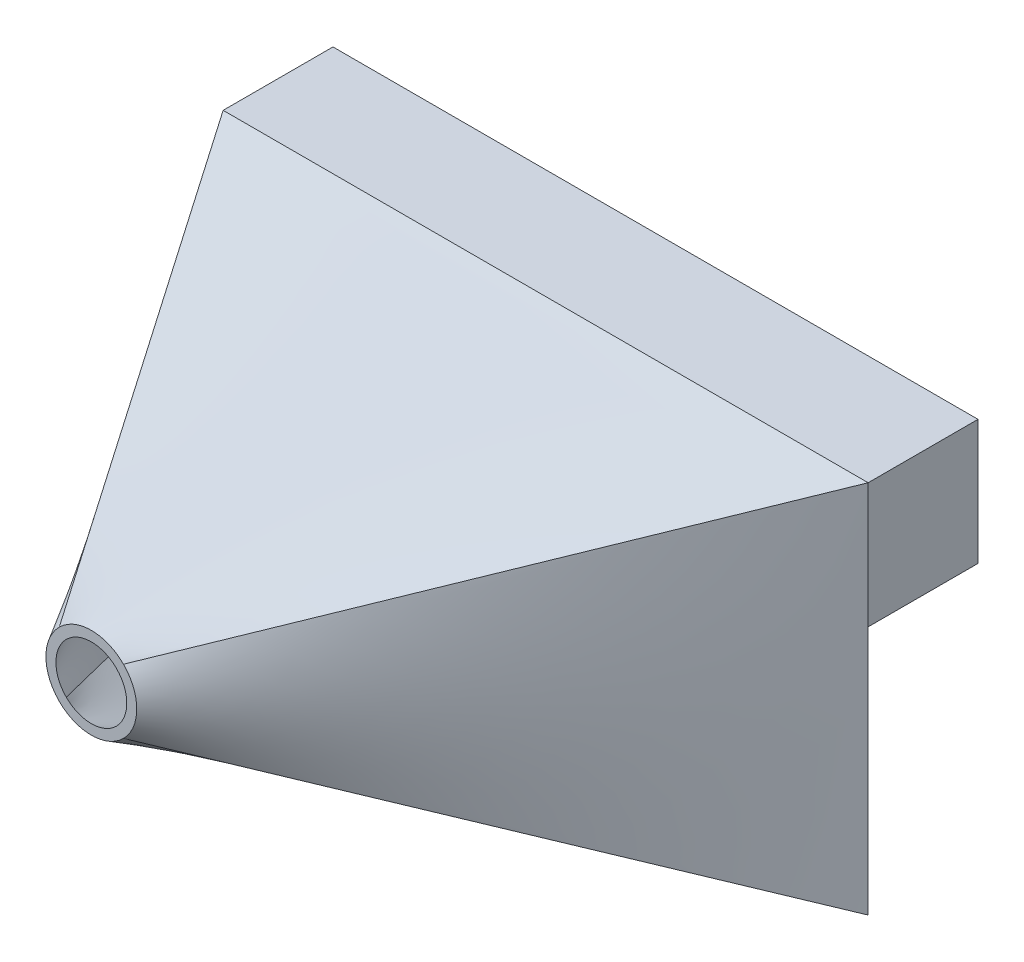
ISO-10303-21;
HEADER;
FILE_DESCRIPTION(('STEP AP214'),'2;1');
FILE_NAME('part.step','',(''),(''),'','','');
FILE_SCHEMA(('AUTOMOTIVE_DESIGN { 1 0 10303 214 1 1 1 1 }'));
ENDSEC;
DATA;
#1=APPLICATION_CONTEXT('core data for automotive mechanical design processes');
#2=APPLICATION_PROTOCOL_DEFINITION('international standard','automotive_design',2000,#1);
#3=PRODUCT_CONTEXT('',#1,'mechanical');
#4=PRODUCT('Part','Part','',(#3));
#5=PRODUCT_RELATED_PRODUCT_CATEGORY('part','',(#4));
#6=PRODUCT_DEFINITION_FORMATION('','',#4);
#7=PRODUCT_DEFINITION_CONTEXT('part definition',#1,'design');
#8=PRODUCT_DEFINITION('design','',#6,#7);
#9=PRODUCT_DEFINITION_SHAPE('','',#8);
#10=(LENGTH_UNIT() NAMED_UNIT(*) SI_UNIT(.MILLI.,.METRE.));
#11=(NAMED_UNIT(*) PLANE_ANGLE_UNIT() SI_UNIT($,.RADIAN.));
#12=(NAMED_UNIT(*) SI_UNIT($,.STERADIAN.) SOLID_ANGLE_UNIT());
#13=UNCERTAINTY_MEASURE_WITH_UNIT(LENGTH_MEASURE(1.E-05),#10,'distance_accuracy_value','');
#14=(GEOMETRIC_REPRESENTATION_CONTEXT(3) GLOBAL_UNCERTAINTY_ASSIGNED_CONTEXT((#13)) GLOBAL_UNIT_ASSIGNED_CONTEXT((#10,
#11,#12)) REPRESENTATION_CONTEXT('',''));
#15=CARTESIAN_POINT('',(0.,0.,0.));
#16=DIRECTION('',(0.,0.,1.));
#17=DIRECTION('',(1.,0.,0.));
#18=AXIS2_PLACEMENT_3D('',#15,#16,#17);
#19=CARTESIAN_POINT('',(-64.6,-37.5,22.));
#20=DIRECTION('',(0.,1.,0.));
#21=DIRECTION('',(0.,0.,1.));
#22=AXIS2_PLACEMENT_3D('',#19,#20,#21);
#23=PLANE('',#22);
#24=DIRECTION('',(1.,0.,0.));
#25=VECTOR('',#24,1.);
#26=CARTESIAN_POINT('',(-64.6,-37.5,0.));
#27=LINE('',#26,#25);
#28=CARTESIAN_POINT('',(-64.6,-37.5,0.));
#29=VERTEX_POINT('',#28);
#30=CARTESIAN_POINT('',(-62.6,-37.5,0.));
#31=VERTEX_POINT('',#30);
#32=EDGE_CURVE('E738',#29,#31,#27,.T.);
#33=ORIENTED_EDGE('',*,*,#32,.T.);
#34=DIRECTION('',(0.,0.,1.));
#35=VECTOR('',#34,1.);
#36=CARTESIAN_POINT('',(-62.6,-37.5,22.));
#37=LINE('',#36,#35);
#38=CARTESIAN_POINT('',(-62.6,-37.5,22.));
#39=VERTEX_POINT('',#38);
#40=EDGE_CURVE('E480',#31,#39,#37,.T.);
#41=ORIENTED_EDGE('',*,*,#40,.T.);
#42=DIRECTION('',(1.,0.,0.));
#43=VECTOR('',#42,1.);
#44=CARTESIAN_POINT('',(-64.6,-37.5,22.));
#45=LINE('',#44,#43);
#46=CARTESIAN_POINT('',(-64.6,-37.5,22.));
#47=VERTEX_POINT('',#46);
#48=EDGE_CURVE('E330',#47,#39,#45,.T.);
#49=ORIENTED_EDGE('',*,*,#48,.F.);
#50=DIRECTION('',(0.,0.,-1.));
#51=VECTOR('',#50,1.);
#52=CARTESIAN_POINT('',(-64.6,-37.5,22.));
#53=LINE('',#52,#51);
#54=EDGE_CURVE('E247',#47,#29,#53,.T.);
#55=ORIENTED_EDGE('',*,*,#54,.T.);
#56=EDGE_LOOP('',(#33,#41,#49,#55));
#57=FACE_BOUND('',#56,.T.);
#58=ADVANCED_FACE('F113',(#57),#23,.F.);
#59=CARTESIAN_POINT('',(0.,0.,0.));
#60=DIRECTION('',(0.,0.,1.));
#61=DIRECTION('',(1.,0.,0.));
#62=AXIS2_PLACEMENT_3D('',#59,#60,#61);
#63=PLANE('',#62);
#64=DIRECTION('',(0.,1.,0.));
#65=VECTOR('',#64,1.);
#66=CARTESIAN_POINT('',(64.6,37.5,0.));
#67=LINE('',#66,#65);
#68=CARTESIAN_POINT('',(64.6,12.5,0.));
#69=VERTEX_POINT('',#68);
#70=CARTESIAN_POINT('',(64.6,37.5,0.));
#71=VERTEX_POINT('',#70);
#72=EDGE_CURVE('E210',#69,#71,#67,.T.);
#73=ORIENTED_EDGE('',*,*,#72,.F.);
#74=DIRECTION('',(-1.,0.,0.));
#75=VECTOR('',#74,1.);
#76=CARTESIAN_POINT('',(72.6,12.5,0.));
#77=LINE('',#76,#75);
#78=CARTESIAN_POINT('',(62.6,12.5,0.));
#79=VERTEX_POINT('',#78);
#80=EDGE_CURVE('E721',#69,#79,#77,.T.);
#81=ORIENTED_EDGE('',*,*,#80,.T.);
#82=DIRECTION('',(0.,1.,0.));
#83=VECTOR('',#82,1.);
#84=CARTESIAN_POINT('',(62.6,35.5,0.));
#85=LINE('',#84,#83);
#86=CARTESIAN_POINT('',(62.6,35.5,0.));
#87=VERTEX_POINT('',#86);
#88=EDGE_CURVE('E729',#79,#87,#85,.T.);
#89=ORIENTED_EDGE('',*,*,#88,.T.);
#90=DIRECTION('',(-1.,0.,0.));
#91=VECTOR('',#90,1.);
#92=CARTESIAN_POINT('',(-62.6,35.5,0.));
#93=LINE('',#92,#91);
#94=CARTESIAN_POINT('',(-62.6,35.5,0.));
#95=VERTEX_POINT('',#94);
#96=EDGE_CURVE('E734',#87,#95,#93,.T.);
#97=ORIENTED_EDGE('',*,*,#96,.T.);
#98=DIRECTION('',(0.,-1.,0.));
#99=VECTOR('',#98,1.);
#100=CARTESIAN_POINT('',(-62.6,35.5,0.));
#101=LINE('',#100,#99);
#102=EDGE_CURVE('E174',#95,#31,#101,.T.);
#103=ORIENTED_EDGE('',*,*,#102,.T.);
#104=ORIENTED_EDGE('',*,*,#32,.F.);
#105=DIRECTION('',(0.,-1.,0.));
#106=VECTOR('',#105,1.);
#107=CARTESIAN_POINT('',(-64.6,37.5,0.));
#108=LINE('',#107,#106);
#109=CARTESIAN_POINT('',(-64.6,37.5,0.));
#110=VERTEX_POINT('',#109);
#111=EDGE_CURVE('E134',#110,#29,#108,.T.);
#112=ORIENTED_EDGE('',*,*,#111,.F.);
#113=DIRECTION('',(-1.,0.,0.));
#114=VECTOR('',#113,1.);
#115=CARTESIAN_POINT('',(-64.6,37.5,0.));
#116=LINE('',#115,#114);
#117=EDGE_CURVE('E216',#71,#110,#116,.T.);
#118=ORIENTED_EDGE('',*,*,#117,.F.);
#119=EDGE_LOOP('',(#73,#81,#89,#97,#103,#104,#112,#118));
#120=FACE_BOUND('',#119,.T.);
#121=ADVANCED_FACE('F219',(#120),#63,.F.);
#122=CARTESIAN_POINT('',(64.6,37.5,22.));
#123=DIRECTION('',(-1.,0.,0.));
#124=DIRECTION('',(0.,0.,1.));
#125=AXIS2_PLACEMENT_3D('',#122,#123,#124);
#126=PLANE('',#125);
#127=DIRECTION('',(0.,1.,0.));
#128=VECTOR('',#127,1.);
#129=CARTESIAN_POINT('',(64.6,37.5,22.));
#130=LINE('',#129,#128);
#131=CARTESIAN_POINT('',(64.6,12.5,22.));
#132=VERTEX_POINT('',#131);
#133=CARTESIAN_POINT('',(64.6,37.5,22.));
#134=VERTEX_POINT('',#133);
#135=EDGE_CURVE('E163',#132,#134,#130,.T.);
#136=ORIENTED_EDGE('',*,*,#135,.F.);
#137=DIRECTION('',(0.,0.,-1.));
#138=VECTOR('',#137,1.);
#139=CARTESIAN_POINT('',(64.6,12.5,22.));
#140=LINE('',#139,#138);
#141=EDGE_CURVE('E213',#132,#69,#140,.T.);
#142=ORIENTED_EDGE('',*,*,#141,.T.);
#143=ORIENTED_EDGE('',*,*,#72,.T.);
#144=DIRECTION('',(0.,0.,-1.));
#145=VECTOR('',#144,1.);
#146=CARTESIAN_POINT('',(64.6,37.5,22.));
#147=LINE('',#146,#145);
#148=EDGE_CURVE('E12',#134,#71,#147,.T.);
#149=ORIENTED_EDGE('',*,*,#148,.F.);
#150=EDGE_LOOP('',(#136,#142,#143,#149));
#151=FACE_BOUND('',#150,.T.);
#152=ADVANCED_FACE('F115',(#151),#126,.F.);
#153=CARTESIAN_POINT('',(-64.6,37.5,22.));
#154=DIRECTION('',(0.,-1.,0.));
#155=DIRECTION('',(0.,0.,-1.));
#156=AXIS2_PLACEMENT_3D('',#153,#154,#155);
#157=PLANE('',#156);
#158=ORIENTED_EDGE('',*,*,#117,.T.);
#159=DIRECTION('',(0.,0.,-1.));
#160=VECTOR('',#159,1.);
#161=CARTESIAN_POINT('',(-64.6,37.5,22.));
#162=LINE('',#161,#160);
#163=CARTESIAN_POINT('',(-64.6,37.5,22.));
#164=VERTEX_POINT('',#163);
#165=EDGE_CURVE('E125',#164,#110,#162,.T.);
#166=ORIENTED_EDGE('',*,*,#165,.F.);
#167=DIRECTION('',(1.,0.,0.));
#168=VECTOR('',#167,1.);
#169=CARTESIAN_POINT('',(-64.6,37.5,22.));
#170=LINE('',#169,#168);
#171=EDGE_CURVE('E227',#134,#164,#170,.F.);
#172=ORIENTED_EDGE('',*,*,#171,.F.);
#173=ORIENTED_EDGE('',*,*,#148,.T.);
#174=EDGE_LOOP('',(#158,#166,#172,#173));
#175=FACE_BOUND('',#174,.T.);
#176=ADVANCED_FACE('F225',(#175),#157,.F.);
#177=CARTESIAN_POINT('',(-64.6,37.5,22.));
#178=DIRECTION('',(1.,0.,0.));
#179=DIRECTION('',(0.,1.,0.));
#180=AXIS2_PLACEMENT_3D('',#177,#178,#179);
#181=PLANE('',#180);
#182=ORIENTED_EDGE('',*,*,#111,.T.);
#183=ORIENTED_EDGE('',*,*,#54,.F.);
#184=DIRECTION('',(0.,1.,0.));
#185=VECTOR('',#184,1.);
#186=CARTESIAN_POINT('',(-64.6,37.5,22.));
#187=LINE('',#186,#185);
#188=EDGE_CURVE('E232',#164,#47,#187,.F.);
#189=ORIENTED_EDGE('',*,*,#188,.F.);
#190=ORIENTED_EDGE('',*,*,#165,.T.);
#191=EDGE_LOOP('',(#182,#183,#189,#190));
#192=FACE_BOUND('',#191,.T.);
#193=ADVANCED_FACE('F573',(#192),#181,.F.);
#194=CARTESIAN_POINT('',(62.6,35.5,22.));
#195=DIRECTION('',(-1.,0.,0.));
#196=DIRECTION('',(0.,0.,1.));
#197=AXIS2_PLACEMENT_3D('',#194,#195,#196);
#198=PLANE('',#197);
#199=DIRECTION('',(0.,0.,-1.));
#200=VECTOR('',#199,1.);
#201=CARTESIAN_POINT('',(62.6,12.5,0.));
#202=LINE('',#201,#200);
#203=CARTESIAN_POINT('',(62.6,12.5,22.));
#204=VERTEX_POINT('',#203);
#205=EDGE_CURVE('E716',#204,#79,#202,.T.);
#206=ORIENTED_EDGE('',*,*,#205,.F.);
#207=DIRECTION('',(0.,1.,0.));
#208=VECTOR('',#207,1.);
#209=CARTESIAN_POINT('',(62.6,35.5,22.));
#210=LINE('',#209,#208);
#211=CARTESIAN_POINT('',(62.6,35.5,22.));
#212=VERTEX_POINT('',#211);
#213=EDGE_CURVE('E726',#204,#212,#210,.T.);
#214=ORIENTED_EDGE('',*,*,#213,.T.);
#215=DIRECTION('',(0.,0.,-1.));
#216=VECTOR('',#215,1.);
#217=CARTESIAN_POINT('',(62.6,35.5,22.));
#218=LINE('',#217,#216);
#219=EDGE_CURVE('E217',#212,#87,#218,.T.);
#220=ORIENTED_EDGE('',*,*,#219,.T.);
#221=ORIENTED_EDGE('',*,*,#88,.F.);
#222=EDGE_LOOP('',(#206,#214,#220,#221));
#223=FACE_BOUND('',#222,.T.);
#224=ADVANCED_FACE('F575',(#223),#198,.T.);
#225=CARTESIAN_POINT('',(-62.6,35.5,22.));
#226=DIRECTION('',(0.,-1.,0.));
#227=DIRECTION('',(0.,0.,-1.));
#228=AXIS2_PLACEMENT_3D('',#225,#226,#227);
#229=PLANE('',#228);
#230=ORIENTED_EDGE('',*,*,#96,.F.);
#231=ORIENTED_EDGE('',*,*,#219,.F.);
#232=DIRECTION('',(1.,0.,0.));
#233=VECTOR('',#232,1.);
#234=CARTESIAN_POINT('',(-62.6,35.5,22.));
#235=LINE('',#234,#233);
#236=CARTESIAN_POINT('',(-62.6,35.5,22.));
#237=VERTEX_POINT('',#236);
#238=EDGE_CURVE('E470',#212,#237,#235,.F.);
#239=ORIENTED_EDGE('',*,*,#238,.T.);
#240=DIRECTION('',(0.,0.,-1.));
#241=VECTOR('',#240,1.);
#242=CARTESIAN_POINT('',(-62.6,35.5,22.));
#243=LINE('',#242,#241);
#244=EDGE_CURVE('E241',#237,#95,#243,.T.);
#245=ORIENTED_EDGE('',*,*,#244,.T.);
#246=EDGE_LOOP('',(#230,#231,#239,#245));
#247=FACE_BOUND('',#246,.T.);
#248=ADVANCED_FACE('F603',(#247),#229,.T.);
#249=CARTESIAN_POINT('',(-62.6,35.5,22.));
#250=DIRECTION('',(1.,0.,0.));
#251=DIRECTION('',(0.,1.,0.));
#252=AXIS2_PLACEMENT_3D('',#249,#250,#251);
#253=PLANE('',#252);
#254=ORIENTED_EDGE('',*,*,#102,.F.);
#255=ORIENTED_EDGE('',*,*,#244,.F.);
#256=DIRECTION('',(0.,1.,0.));
#257=VECTOR('',#256,1.);
#258=CARTESIAN_POINT('',(-62.6,35.5,22.));
#259=LINE('',#258,#257);
#260=CARTESIAN_POINT('',(-62.6,-35.5,22.));
#261=VERTEX_POINT('',#260);
#262=EDGE_CURVE('E324',#237,#261,#259,.F.);
#263=ORIENTED_EDGE('',*,*,#262,.T.);
#264=DIRECTION('',(0.,1.,0.));
#265=VECTOR('',#264,1.);
#266=CARTESIAN_POINT('',(-62.6,-45.5,22.));
#267=LINE('',#266,#265);
#268=EDGE_CURVE('E762',#39,#261,#267,.T.);
#269=ORIENTED_EDGE('',*,*,#268,.F.);
#270=ORIENTED_EDGE('',*,*,#40,.F.);
#271=EDGE_LOOP('',(#254,#255,#263,#269,#270));
#272=FACE_BOUND('',#271,.T.);
#273=ADVANCED_FACE('F273',(#272),#253,.T.);
#274=CARTESIAN_POINT('',(-17.,-1.,96.));
#275=DIRECTION('',(0.,0.,1.));
#276=DIRECTION('',(1.,0.,0.));
#277=AXIS2_PLACEMENT_3D('',#274,#275,#276);
#278=PLANE('',#277);
#279=CARTESIAN_POINT('',(-17.,-1.,96.));
#280=DIRECTION('',(0.,0.,1.));
#281=DIRECTION('',(1.,0.,0.));
#282=AXIS2_PLACEMENT_3D('',#279,#280,#281);
#283=CIRCLE('',#282,9.10000000003909);
#284=CARTESIAN_POINT('',(-10.5653282911529,-7.43467170884706,96.));
#285=VERTEX_POINT('',#284);
#286=CARTESIAN_POINT('',(-10.5653282911899,5.43467170884032,96.));
#287=VERTEX_POINT('',#286);
#288=EDGE_CURVE('E479',#285,#287,#283,.T.);
#289=ORIENTED_EDGE('',*,*,#288,.T.);
#290=CARTESIAN_POINT('',(-17.,-1.,96.));
#291=DIRECTION('',(0.,0.,1.));
#292=DIRECTION('',(1.,0.,0.));
#293=AXIS2_PLACEMENT_3D('',#290,#291,#292);
#294=CIRCLE('',#293,9.09999999996391);
#295=CARTESIAN_POINT('',(-23.4346717088471,5.43467170884706,96.));
#296=VERTEX_POINT('',#295);
#297=EDGE_CURVE('E436',#287,#296,#294,.T.);
#298=ORIENTED_EDGE('',*,*,#297,.T.);
#299=CARTESIAN_POINT('',(-17.,-1.,96.));
#300=DIRECTION('',(0.,0.,1.));
#301=DIRECTION('',(-1.,0.,0.));
#302=AXIS2_PLACEMENT_3D('',#299,#300,#301);
#303=CIRCLE('',#302,9.10000000006997);
#304=CARTESIAN_POINT('',(-23.4346717088266,-7.43467170886753,96.));
#305=VERTEX_POINT('',#304);
#306=EDGE_CURVE('E350',#296,#305,#303,.T.);
#307=ORIENTED_EDGE('',*,*,#306,.T.);
#308=CARTESIAN_POINT('',(-17.,-1.,96.));
#309=DIRECTION('',(0.,0.,1.));
#310=DIRECTION('',(1.,0.,0.));
#311=AXIS2_PLACEMENT_3D('',#308,#309,#310);
#312=CIRCLE('',#311,9.10000000006997);
#313=EDGE_CURVE('E325',#305,#285,#312,.T.);
#314=ORIENTED_EDGE('',*,*,#313,.T.);
#315=EDGE_LOOP('',(#289,#298,#307,#314));
#316=FACE_BOUND('',#315,.T.);
#317=CARTESIAN_POINT('',(-17.,-1.,96.));
#318=DIRECTION('',(0.,0.,-1.));
#319=DIRECTION('',(1.,0.,0.));
#320=AXIS2_PLACEMENT_3D('',#317,#318,#319);
#321=CIRCLE('',#320,7.09999999993093);
#322=CARTESIAN_POINT('',(-22.0204581464245,4.02045814642449,96.));
#323=VERTEX_POINT('',#322);
#324=CARTESIAN_POINT('',(-11.9795418536394,4.02045814639074,96.));
#325=VERTEX_POINT('',#324);
#326=EDGE_CURVE('E431',#323,#325,#321,.T.);
#327=ORIENTED_EDGE('',*,*,#326,.T.);
#328=CARTESIAN_POINT('',(-17.,-1.,96.));
#329=DIRECTION('',(0.,0.,-1.));
#330=DIRECTION('',(1.,0.,0.));
#331=AXIS2_PLACEMENT_3D('',#328,#329,#330);
#332=CIRCLE('',#331,7.09999999998014);
#333=CARTESIAN_POINT('',(-11.9795418535565,-6.02045814644693,96.));
#334=VERTEX_POINT('',#333);
#335=EDGE_CURVE('E415',#325,#334,#332,.T.);
#336=ORIENTED_EDGE('',*,*,#335,.T.);
#337=CARTESIAN_POINT('',(-17.,-1.,96.));
#338=DIRECTION('',(0.,0.,-1.));
#339=DIRECTION('',(1.,0.,0.));
#340=AXIS2_PLACEMENT_3D('',#337,#338,#339);
#341=CIRCLE('',#340,7.10000000003904);
#342=CARTESIAN_POINT('',(-22.0204581464337,-6.02045814647048,96.));
#343=VERTEX_POINT('',#342);
#344=EDGE_CURVE('E329',#334,#343,#341,.T.);
#345=ORIENTED_EDGE('',*,*,#344,.T.);
#346=CARTESIAN_POINT('',(-17.,-1.,96.));
#347=DIRECTION('',(0.,0.,-1.));
#348=DIRECTION('',(1.,0.,0.));
#349=AXIS2_PLACEMENT_3D('',#346,#347,#348);
#350=CIRCLE('',#349,7.1);
#351=EDGE_CURVE('E254',#343,#323,#350,.T.);
#352=ORIENTED_EDGE('',*,*,#351,.T.);
#353=EDGE_LOOP('',(#327,#336,#345,#352));
#354=FACE_BOUND('',#353,.T.);
#355=ADVANCED_FACE('F262',(#316,#354),#278,.T.);
#356=CARTESIAN_POINT('',(-62.6,35.5,22.));
#357=CARTESIAN_POINT('',(-22.0204581463756,4.02045814637565,96.));
#358=CARTESIAN_POINT('',(-57.3833333333333,35.5,22.));
#359=CARTESIAN_POINT('',(-21.7246248130456,4.31629147970566,96.));
#360=CARTESIAN_POINT('',(-52.1666666666667,35.5,22.));
#361=CARTESIAN_POINT('',(-21.3914294559345,4.59688903036113,96.));
#362=CARTESIAN_POINT('',(-41.7333333333334,35.5,22.));
#363=CARTESIAN_POINT('',(-20.6547816609089,5.10347364176412,96.));
#364=CARTESIAN_POINT('',(-36.5166666666667,35.5,22.));
#365=CARTESIAN_POINT('',(-20.2512916042196,5.32929668338113,96.));
#366=CARTESIAN_POINT('',(-26.0833333333334,35.5,22.));
#367=CARTESIAN_POINT('',(-19.3886267302209,5.70263798407781,96.));
#368=CARTESIAN_POINT('',(-20.8666666666667,35.5,22.));
#369=CARTESIAN_POINT('',(-18.929519451681,5.84997325082757,96.));
#370=CARTESIAN_POINT('',(-10.4333333333334,35.5,22.));
#371=CARTESIAN_POINT('',(-17.9801950855716,6.04871594304167,96.));
#372=CARTESIAN_POINT('',(-5.2166666666667,35.5,22.));
#373=CARTESIAN_POINT('',(-17.4901527154797,6.09999999993019,96.));
#374=CARTESIAN_POINT('',(5.21666666666662,35.5,22.));
#375=CARTESIAN_POINT('',(-16.5098472845416,6.09999999993167,96.));
#376=CARTESIAN_POINT('',(10.4333333333333,35.5,22.));
#377=CARTESIAN_POINT('',(-16.0198049144496,6.04871594304462,96.));
#378=CARTESIAN_POINT('',(20.8666666666666,35.5,22.));
#379=CARTESIAN_POINT('',(-15.0704805483396,5.84997325083337,96.));
#380=CARTESIAN_POINT('',(26.0833333333332,35.5,22.));
#381=CARTESIAN_POINT('',(-14.6113732697993,5.702637984085,96.));
#382=CARTESIAN_POINT('',(36.5166666666666,35.5,22.));
#383=CARTESIAN_POINT('',(-13.7487083957994,5.32929668339091,96.));
#384=CARTESIAN_POINT('',(41.7333333333333,35.5,22.));
#385=CARTESIAN_POINT('',(-13.3452183391094,5.10347364177511,96.));
#386=CARTESIAN_POINT('',(52.1666666666666,35.5,22.));
#387=CARTESIAN_POINT('',(-12.6085705440823,4.59688903037433,96.));
#388=CARTESIAN_POINT('',(57.3833333333333,35.5,22.));
#389=CARTESIAN_POINT('',(-12.2753751869703,4.31629147971986,96.));
#390=CARTESIAN_POINT('',(62.6,35.5,22.));
#391=CARTESIAN_POINT('',(-11.9795418536394,4.02045814639073,96.));
#392=B_SPLINE_SURFACE_WITH_KNOTS('',3,1,((#356,#357),(#358,#359),(#360,#361),(#362,#363),(#364,
#365),(#366,#367),(#368,#369),(#370,#371),(#372,#373),(#374,#375),(#376,#377),(#378,#379),(#380,
#381),(#382,#383),(#384,#385),(#386,#387),(#388,#389),(#390,#391)),.UNSPECIFIED.,.F.,.F.,.F.,(4,
2,2,2,2,2,2,2,4),(2,2),(0.,0.125,0.25,0.375,0.5,0.624999999999999,0.749999999999999,0.875,1.),
(0.,1.),.UNSPECIFIED.);
#393=DIRECTION('',(-0.679991825607433,-0.287020147915762,0.674707752880819));
#394=VECTOR('',#393,1.);
#395=CARTESIAN_POINT('',(62.6,35.5,22.));
#396=LINE('',#395,#394);
#397=EDGE_CURVE('E438',#212,#325,#396,.T.);
#398=DIRECTION('',(0.450504067453947,-0.349478111354722,0.821529752894797));
#399=VECTOR('',#398,1.);
#400=CARTESIAN_POINT('',(-62.6,35.5,22.));
#401=LINE('',#400,#399);
#402=EDGE_CURVE('E426',#237,#323,#401,.T.);
#403=ORIENTED_EDGE('',*,*,#238,.F.);
#404=ORIENTED_EDGE('',*,*,#397,.T.);
#405=ORIENTED_EDGE('',*,*,#326,.F.);
#406=ORIENTED_EDGE('',*,*,#402,.F.);
#407=EDGE_LOOP('',(#403,#404,#405,#406));
#408=FACE_BOUND('',#407,.T.);
#409=ADVANCED_FACE('F272',(#408),#392,.T.);
#410=CARTESIAN_POINT('',(64.6,37.5,22.));
#411=CARTESIAN_POINT('',(-10.5653282912253,5.43467170876941,96.));
#412=CARTESIAN_POINT('',(59.2166666666667,37.5,22.));
#413=CARTESIAN_POINT('',(-10.9444949578904,5.81383837543481,96.));
#414=CARTESIAN_POINT('',(53.8333333333334,37.5,22.));
#415=CARTESIAN_POINT('',(-11.3715481620782,6.17347748965806,96.));
#416=CARTESIAN_POINT('',(43.0666666666668,37.5,22.));
#417=CARTESIAN_POINT('',(-12.315702378245,6.82276199160222,96.));
#418=CARTESIAN_POINT('',(37.6833333333334,37.5,22.));
#419=CARTESIAN_POINT('',(-12.8328516058368,7.11219715762062,96.));
#420=CARTESIAN_POINT('',(26.9166666666668,37.5,22.));
#421=CARTESIAN_POINT('',(-13.9385206697034,7.59070502189728,96.));
#422=CARTESIAN_POINT('',(21.5333333333335,37.5,22.));
#423=CARTESIAN_POINT('',(-14.526953942203,7.77954318069043,96.));
#424=CARTESIAN_POINT('',(10.7666666666668,37.5,22.));
#425=CARTESIAN_POINT('',(-15.7436936227195,8.03426972986734,96.));
#426=CARTESIAN_POINT('',(5.3833333333335,37.5,22.));
#427=CARTESIAN_POINT('',(-16.3717760970679,8.09999999996378,96.));
#428=CARTESIAN_POINT('',(-5.38333333333316,37.5,22.));
#429=CARTESIAN_POINT('',(-17.6282239029283,8.09999999996404,96.));
#430=CARTESIAN_POINT('',(-10.7666666666665,37.5,22.));
#431=CARTESIAN_POINT('',(-18.2563063772767,8.03426972986786,96.));
#432=CARTESIAN_POINT('',(-21.5333333333332,37.5,22.));
#433=CARTESIAN_POINT('',(-19.4730460577934,7.77954318069145,96.));
#434=CARTESIAN_POINT('',(-26.9166666666665,37.5,22.));
#435=CARTESIAN_POINT('',(-20.0614793302931,7.59070502189854,96.));
#436=CARTESIAN_POINT('',(-37.6833333333332,37.5,22.));
#437=CARTESIAN_POINT('',(-21.1671483941598,7.11219715762234,96.));
#438=CARTESIAN_POINT('',(-43.0666666666666,37.5,22.));
#439=CARTESIAN_POINT('',(-21.6842976217518,6.82276199160415,96.));
#440=CARTESIAN_POINT('',(-53.8333333333333,37.5,22.));
#441=CARTESIAN_POINT('',(-22.6284518379188,6.17347748966038,96.));
#442=CARTESIAN_POINT('',(-59.2166666666666,37.5,22.));
#443=CARTESIAN_POINT('',(-23.0555050421068,5.8138383754373,96.));
#444=CARTESIAN_POINT('',(-64.6,37.5,22.));
#445=CARTESIAN_POINT('',(-23.4346717087721,5.43467170877206,96.));
#446=B_SPLINE_SURFACE_WITH_KNOTS('',3,1,((#410,#411),(#412,#413),(#414,#415),(#416,#417),(#418,
#419),(#420,#421),(#422,#423),(#424,#425),(#426,#427),(#428,#429),(#430,#431),(#432,#433),(#434,
#435),(#436,#437),(#438,#439),(#440,#441),(#442,#443),(#444,#445)),.UNSPECIFIED.,.F.,.F.,.F.,(4,
2,2,2,2,2,2,2,4),(2,2),(0.,0.125,0.25,0.375,0.5,0.625,0.75,0.875,1.),(0.,1.),.UNSPECIFIED.);
#447=DIRECTION('',(0.454629113901018,-0.354128884503337,0.817254612684442));
#448=VECTOR('',#447,1.);
#449=CARTESIAN_POINT('',(-44.017335854386,21.467335854386,59.));
#450=LINE('',#449,#448);
#451=EDGE_CURVE('E432',#164,#296,#450,.T.);
#452=DIRECTION('',(-0.681801152165622,-0.29085455050267,0.671230824200975));
#453=VECTOR('',#452,1.);
#454=CARTESIAN_POINT('',(64.6,37.5,22.));
#455=LINE('',#454,#453);
#456=EDGE_CURVE('E410',#134,#287,#455,.T.);
#457=ORIENTED_EDGE('',*,*,#171,.T.);
#458=ORIENTED_EDGE('',*,*,#451,.T.);
#459=ORIENTED_EDGE('',*,*,#297,.F.);
#460=ORIENTED_EDGE('',*,*,#456,.F.);
#461=EDGE_LOOP('',(#457,#458,#459,#460));
#462=FACE_BOUND('',#461,.T.);
#463=ADVANCED_FACE('F275',(#462),#446,.T.);
#464=CARTESIAN_POINT('',(-64.6,37.5,22.));
#465=CARTESIAN_POINT('',(-23.4346717088471,5.43467170884706,96.));
#466=CARTESIAN_POINT('',(-64.6,34.375,22.));
#467=CARTESIAN_POINT('',(-23.8138383755173,5.05550504217688,96.));
#468=CARTESIAN_POINT('',(-64.6,31.25,22.));
#469=CARTESIAN_POINT('',(-24.173477489745,4.62845183798319,96.));
#470=CARTESIAN_POINT('',(-64.6,25.,22.));
#471=CARTESIAN_POINT('',(-24.8227619916971,3.68429762180344,96.));
#472=CARTESIAN_POINT('',(-64.6,21.875,22.));
#473=CARTESIAN_POINT('',(-25.112197157719,3.16714839420446,96.));
#474=CARTESIAN_POINT('',(-64.6,15.625,22.));
#475=CARTESIAN_POINT('',(-25.590705022001,2.06147933032257,96.));
#476=CARTESIAN_POINT('',(-64.6,12.5,22.));
#477=CARTESIAN_POINT('',(-25.779543180796,1.4730460578147,96.));
#478=CARTESIAN_POINT('',(-64.6,6.25000000000001,22.));
#479=CARTESIAN_POINT('',(-26.0342697299746,0.256306377281342,96.));
#480=CARTESIAN_POINT('',(-64.6,3.12500000000001,22.));
#481=CARTESIAN_POINT('',(-26.100000000071,-0.371776097075703,96.));
#482=CARTESIAN_POINT('',(-64.6,-3.12499999999999,22.));
#483=CARTESIAN_POINT('',(-26.100000000069,-1.62822390295325,96.));
#484=CARTESIAN_POINT('',(-64.6,-6.24999999999999,22.));
#485=CARTESIAN_POINT('',(-26.0342697299706,-2.25630637731008,96.));
#486=CARTESIAN_POINT('',(-64.6,-12.5,22.));
#487=CARTESIAN_POINT('',(-25.7795431807881,-3.47304605784263,96.));
#488=CARTESIAN_POINT('',(-64.6,-15.625,22.));
#489=CARTESIAN_POINT('',(-25.5907050219912,-4.0614793303499,96.));
#490=CARTESIAN_POINT('',(-64.6,-21.875,22.));
#491=CARTESIAN_POINT('',(-25.1121971577057,-5.16714839423026,96.));
#492=CARTESIAN_POINT('',(-64.6,-25.,22.));
#493=CARTESIAN_POINT('',(-24.8227619916822,-5.68429762182833,96.));
#494=CARTESIAN_POINT('',(-64.6,-31.25,22.));
#495=CARTESIAN_POINT('',(-24.1734774897271,-6.62845183800601,96.));
#496=CARTESIAN_POINT('',(-64.6,-34.375,22.));
#497=CARTESIAN_POINT('',(-23.813838375498,-7.05550504219855,96.));
#498=CARTESIAN_POINT('',(-64.6,-37.5,22.));
#499=CARTESIAN_POINT('',(-23.4346717088266,-7.43467170886753,96.));
#500=B_SPLINE_SURFACE_WITH_KNOTS('',3,1,((#464,#465),(#466,#467),(#468,#469),(#470,#471),(#472,
#473),(#474,#475),(#476,#477),(#478,#479),(#480,#481),(#482,#483),(#484,#485),(#486,#487),(#488,
#489),(#490,#491),(#492,#493),(#494,#495),(#496,#497),(#498,#499)),.UNSPECIFIED.,.F.,.F.,.F.,(4,
2,2,2,2,2,2,2,4),(2,2),(0.,0.125,0.25,0.375,0.5,0.625,0.75,0.875,1.),(0.,1.),.UNSPECIFIED.);
#501=DIRECTION('',(0.458113977558624,0.334586111706287,0.823519105679209));
#502=VECTOR('',#501,1.);
#503=CARTESIAN_POINT('',(-64.6,-37.5,22.));
#504=LINE('',#503,#502);
#505=EDGE_CURVE('E338',#47,#305,#504,.T.);
#506=ORIENTED_EDGE('',*,*,#188,.T.);
#507=ORIENTED_EDGE('',*,*,#505,.T.);
#508=ORIENTED_EDGE('',*,*,#306,.F.);
#509=ORIENTED_EDGE('',*,*,#451,.F.);
#510=EDGE_LOOP('',(#506,#507,#508,#509));
#511=FACE_BOUND('',#510,.T.);
#512=ADVANCED_FACE('F357',(#511),#500,.T.);
#513=CARTESIAN_POINT('',(-62.6,-35.5,22.));
#514=CARTESIAN_POINT('',(-22.0204581464144,-6.02045814643454,96.));
#515=CARTESIAN_POINT('',(-62.6,-32.5416666666666,22.));
#516=CARTESIAN_POINT('',(-22.3162914797487,-5.7246248131015,96.));
#517=CARTESIAN_POINT('',(-62.6,-29.5833333333333,22.));
#518=CARTESIAN_POINT('',(-22.5968890304082,-5.3914294559867,96.));
#519=CARTESIAN_POINT('',(-62.6,-23.6666666666666,22.));
#520=CARTESIAN_POINT('',(-23.1034736418187,-4.6547816609526,96.));
#521=CARTESIAN_POINT('',(-62.6,-20.7083333333332,22.));
#522=CARTESIAN_POINT('',(-23.3292966834392,-4.25129160425838,96.));
#523=CARTESIAN_POINT('',(-62.6,-14.7916666666666,22.));
#524=CARTESIAN_POINT('',(-23.7026379841415,-3.38862673024879,96.));
#525=CARTESIAN_POINT('',(-62.6,-11.8333333333332,22.));
#526=CARTESIAN_POINT('',(-23.8499732508934,-2.92951945170294,96.));
#527=CARTESIAN_POINT('',(-62.6,-5.91666666666653,22.));
#528=CARTESIAN_POINT('',(-24.0487159431104,-1.98019508558107,96.));
#529=CARTESIAN_POINT('',(-62.6,-2.95833333333319,22.));
#530=CARTESIAN_POINT('',(-24.0999999999995,-1.49015271548263,96.));
#531=CARTESIAN_POINT('',(-62.6,2.95833333333347,22.));
#532=CARTESIAN_POINT('',(-24.1000000000005,-0.509847284531583,96.));
#533=CARTESIAN_POINT('',(-62.6,5.9166666666668,22.));
#534=CARTESIAN_POINT('',(-24.0487159431123,-0.0198049144330414,96.));
#535=CARTESIAN_POINT('',(-62.6,11.8333333333335,22.));
#536=CARTESIAN_POINT('',(-23.8499732508973,0.929519451689226,96.));
#537=CARTESIAN_POINT('',(-62.6,14.7916666666668,22.));
#538=CARTESIAN_POINT('',(-23.7026379841462,1.38862673023537,96.));
#539=CARTESIAN_POINT('',(-62.6,20.7083333333334,22.));
#540=CARTESIAN_POINT('',(-23.3292966834457,2.25129160424571,96.));
#541=CARTESIAN_POINT('',(-62.6,23.6666666666667,22.));
#542=CARTESIAN_POINT('',(-23.1034736418261,2.65478166094038,96.));
#543=CARTESIAN_POINT('',(-62.6,29.5833333333334,22.));
#544=CARTESIAN_POINT('',(-22.596889030417,3.39142945597549,96.));
#545=CARTESIAN_POINT('',(-62.6,32.5416666666667,22.));
#546=CARTESIAN_POINT('',(-22.3162914797581,3.72462481309086,96.));
#547=CARTESIAN_POINT('',(-62.6,35.5,22.));
#548=CARTESIAN_POINT('',(-22.0204581464245,4.02045814642449,96.));
#549=B_SPLINE_SURFACE_WITH_KNOTS('',3,1,((#513,#514),(#515,#516),(#517,#518),(#519,#520),(#521,
#522),(#523,#524),(#525,#526),(#527,#528),(#529,#530),(#531,#532),(#533,#534),(#535,#536),(#537,
#538),(#539,#540),(#541,#542),(#543,#544),(#545,#546),(#547,#548)),.UNSPECIFIED.,.F.,.F.,.F.,(4,
2,2,2,2,2,2,2,4),(2,2),(0.,0.125,0.25,0.375,0.5,0.625,0.75,0.875,1.),(0.,1.),.UNSPECIFIED.);
#550=DIRECTION('',(0.453927396999427,0.32976152728896,0.827772464734952));
#551=VECTOR('',#550,1.);
#552=CARTESIAN_POINT('',(-62.6,-35.5,22.));
#553=LINE('',#552,#551);
#554=EDGE_CURVE('E328',#261,#343,#553,.T.);
#555=ORIENTED_EDGE('',*,*,#262,.F.);
#556=ORIENTED_EDGE('',*,*,#402,.T.);
#557=ORIENTED_EDGE('',*,*,#351,.F.);
#558=ORIENTED_EDGE('',*,*,#554,.F.);
#559=EDGE_LOOP('',(#555,#556,#557,#558));
#560=FACE_BOUND('',#559,.T.);
#561=ADVANCED_FACE('F369',(#560),#549,.T.);
#562=CARTESIAN_POINT('',(-64.6,-37.5,22.));
#563=CARTESIAN_POINT('',(-23.4346717088266,-7.43467170886753,96.));
#564=CARTESIAN_POINT('',(-59.2166666666666,-37.5,22.));
#565=CARTESIAN_POINT('',(-23.0555050421564,-7.8138383755353,96.));
#566=CARTESIAN_POINT('',(-53.8333333333333,-37.5,22.));
#567=CARTESIAN_POINT('',(-22.6284518379632,-8.17347748976057,96.));
#568=CARTESIAN_POINT('',(-43.0666666666667,-37.5,22.));
#569=CARTESIAN_POINT('',(-21.6842976217853,-8.82276199170788,96.));
#570=CARTESIAN_POINT('',(-37.6833333333333,-37.5,22.));
#571=CARTESIAN_POINT('',(-21.1671483941877,-9.11219715772742,96.));
#572=CARTESIAN_POINT('',(-26.9166666666667,-37.5,22.));
#573=CARTESIAN_POINT('',(-20.0614793303095,-9.59070502200544,96.));
#574=CARTESIAN_POINT('',(-21.5333333333334,-37.5,22.));
#575=CARTESIAN_POINT('',(-19.4730460578039,-9.7795431807988,96.));
#576=CARTESIAN_POINT('',(-10.7666666666667,-37.5,22.));
#577=CARTESIAN_POINT('',(-18.2563063772757,-10.0342697299752,96.));
#578=CARTESIAN_POINT('',(-5.38333333333335,-37.5,22.));
#579=CARTESIAN_POINT('',(-17.6282239029215,-10.100000000071,96.));
#580=CARTESIAN_POINT('',(5.38333333333329,-37.5,22.));
#581=CARTESIAN_POINT('',(-16.3717760970496,-10.100000000069,96.));
#582=CARTESIAN_POINT('',(10.7666666666666,-37.5,22.));
#583=CARTESIAN_POINT('',(-15.7436936226956,-10.0342697299712,96.));
#584=CARTESIAN_POINT('',(21.5333333333332,-37.5,22.));
#585=CARTESIAN_POINT('',(-14.5269539421681,-9.77954318079094,96.));
#586=CARTESIAN_POINT('',(26.9166666666666,-37.5,22.));
#587=CARTESIAN_POINT('',(-13.9385206696632,-9.5907050219957,96.));
#588=CARTESIAN_POINT('',(37.6833333333333,-37.5,22.));
#589=CARTESIAN_POINT('',(-12.8328516057865,-9.11219715771417,96.));
#590=CARTESIAN_POINT('',(43.0666666666666,-37.5,22.));
#591=CARTESIAN_POINT('',(-12.3157023781899,-8.82276199169298,96.));
#592=CARTESIAN_POINT('',(53.8333333333333,-37.5,22.));
#593=CARTESIAN_POINT('',(-11.371548162014,-8.17347748974266,96.));
#594=CARTESIAN_POINT('',(59.2166666666666,-37.5,22.));
#595=CARTESIAN_POINT('',(-10.9444949578219,-7.81383837551604,96.));
#596=CARTESIAN_POINT('',(64.5999999999999,-37.5,22.));
#597=CARTESIAN_POINT('',(-10.5653282911529,-7.43467170884706,96.));
#598=B_SPLINE_SURFACE_WITH_KNOTS('',3,1,((#562,#563),(#564,#565),(#566,#567),(#568,#569),(#570,
#571),(#572,#573),(#574,#575),(#576,#577),(#578,#579),(#580,#581),(#582,#583),(#584,#585),(#586,
#587),(#588,#589),(#590,#591),(#592,#593),(#594,#595),(#596,#597)),.UNSPECIFIED.,.F.,.F.,.F.,(4,
2,2,2,2,2,2,2,4),(2,2),(0.,0.125,0.25,0.375,0.5,0.624999999999999,0.75,0.875,1.),(0.,1.),.UNSPECIFIED.);
#599=CARTESIAN_POINT('',(64.6,-37.5,22.));
#600=VERTEX_POINT('',#599);
#601=EDGE_CURVE('E117',#39,#600,#45,.T.);
#602=DIRECTION('',(-0.685313438068348,0.274118053712921,0.674688657257242));
#603=VECTOR('',#602,1.);
#604=CARTESIAN_POINT('',(64.6,-37.5,22.));
#605=LINE('',#604,#603);
#606=EDGE_CURVE('E421',#600,#285,#605,.T.);
#607=ORIENTED_EDGE('',*,*,#48,.T.);
#608=ORIENTED_EDGE('',*,*,#601,.T.);
#609=ORIENTED_EDGE('',*,*,#606,.T.);
#610=ORIENTED_EDGE('',*,*,#313,.F.);
#611=ORIENTED_EDGE('',*,*,#505,.F.);
#612=EDGE_LOOP('',(#607,#608,#609,#610,#611));
#613=FACE_BOUND('',#612,.T.);
#614=ADVANCED_FACE('F384',(#613),#598,.T.);
#615=CARTESIAN_POINT('',(62.6,-35.5,22.));
#616=CARTESIAN_POINT('',(-11.97954185355,-6.02045814645418,96.));
#617=CARTESIAN_POINT('',(57.3833333333333,-35.5,22.));
#618=CARTESIAN_POINT('',(-12.2753751868845,-6.31629147978841,96.));
#619=CARTESIAN_POINT('',(52.1666666666666,-35.5,22.));
#620=CARTESIAN_POINT('',(-12.6085705440006,-6.59688903044787,96.));
#621=CARTESIAN_POINT('',(41.7333333333332,-35.5,22.));
#622=CARTESIAN_POINT('',(-13.3452183390371,-7.10347364185804,96.));
#623=CARTESIAN_POINT('',(36.5166666666665,-35.5,22.));
#624=CARTESIAN_POINT('',(-13.7487083957323,-7.32929668347823,96.));
#625=CARTESIAN_POINT('',(26.0833333333332,-35.5,22.));
#626=CARTESIAN_POINT('',(-14.6113732697436,-7.70263798418018,96.));
#627=CARTESIAN_POINT('',(20.8666666666665,-35.5,22.));
#628=CARTESIAN_POINT('',(-15.0704805482902,-7.84997325093202,96.));
#629=CARTESIAN_POINT('',(10.4333333333331,-35.5,22.));
#630=CARTESIAN_POINT('',(-16.0198049144134,-8.04871594314897,96.));
#631=CARTESIAN_POINT('',(5.21666666666646,-35.5,22.));
#632=CARTESIAN_POINT('',(-16.5098472845124,-8.10000000003825,96.));
#633=CARTESIAN_POINT('',(-5.21666666666687,-35.5,22.));
#634=CARTESIAN_POINT('',(-17.4901527154646,-8.10000000003984,96.));
#635=CARTESIAN_POINT('',(-10.4333333333335,-35.5,22.));
#636=CARTESIAN_POINT('',(-17.9801950855638,-8.04871594315215,96.));
#637=CARTESIAN_POINT('',(-20.8666666666668,-35.5,22.));
#638=CARTESIAN_POINT('',(-18.9295194516875,-7.84997325093828,96.));
#639=CARTESIAN_POINT('',(-26.0833333333335,-35.5,22.));
#640=CARTESIAN_POINT('',(-19.3886267302346,-7.70263798418794,96.));
#641=CARTESIAN_POINT('',(-36.5166666666668,-35.5,22.));
#642=CARTESIAN_POINT('',(-20.2512916042472,-7.32929668348879,96.));
#643=CARTESIAN_POINT('',(-41.7333333333334,-35.5,22.));
#644=CARTESIAN_POINT('',(-20.6547816609431,-7.1034736418699,96.));
#645=CARTESIAN_POINT('',(-52.1666666666667,-35.5,22.));
#646=CARTESIAN_POINT('',(-21.3914294559812,-6.59688903046213,96.));
#647=CARTESIAN_POINT('',(-57.3833333333333,-35.5,22.));
#648=CARTESIAN_POINT('',(-21.7246248130983,-6.31629147980375,96.));
#649=CARTESIAN_POINT('',(-62.6,-35.5,22.));
#650=CARTESIAN_POINT('',(-22.0204581464337,-6.02045814647048,96.));
#651=B_SPLINE_SURFACE_WITH_KNOTS('',3,1,((#615,#616),(#617,#618),(#619,#620),(#621,#622),(#623,
#624),(#625,#626),(#627,#628),(#629,#630),(#631,#632),(#633,#634),(#635,#636),(#637,#638),(#639,
#640),(#641,#642),(#643,#644),(#645,#646),(#647,#648),(#649,#650)),.UNSPECIFIED.,.F.,.F.,.F.,(4,
2,2,2,2,2,2,2,4),(2,2),(0.,0.125,0.25,0.375,0.5,0.625,0.75,0.875,1.),(0.,1.),.UNSPECIFIED.);
#652=DIRECTION('',(1.,0.,0.));
#653=VECTOR('',#652,1.);
#654=CARTESIAN_POINT('',(-62.6,-35.5,22.));
#655=LINE('',#654,#653);
#656=CARTESIAN_POINT('',(62.6,-35.5,22.));
#657=VERTEX_POINT('',#656);
#658=EDGE_CURVE('E244',#261,#657,#655,.T.);
#659=DIRECTION('',(-0.683464202009156,0.270157352107281,0.678153146180397));
#660=VECTOR('',#659,1.);
#661=CARTESIAN_POINT('',(62.6,-35.5,22.));
#662=LINE('',#661,#660);
#663=EDGE_CURVE('E492',#657,#334,#662,.T.);
#664=ORIENTED_EDGE('',*,*,#658,.F.);
#665=ORIENTED_EDGE('',*,*,#554,.T.);
#666=ORIENTED_EDGE('',*,*,#344,.F.);
#667=ORIENTED_EDGE('',*,*,#663,.F.);
#668=EDGE_LOOP('',(#664,#665,#666,#667));
#669=FACE_BOUND('',#668,.T.);
#670=ADVANCED_FACE('F370',(#669),#651,.T.);
#671=CARTESIAN_POINT('',(62.6,35.5,22.));
#672=CARTESIAN_POINT('',(-11.9795418536047,4.02045814642553,96.));
#673=CARTESIAN_POINT('',(62.6,32.5416666666667,22.));
#674=CARTESIAN_POINT('',(-11.6837085202708,3.72462481309342,96.));
#675=CARTESIAN_POINT('',(62.6,29.5833333333333,22.));
#676=CARTESIAN_POINT('',(-11.4031109696115,3.39142945597958,96.));
#677=CARTESIAN_POINT('',(62.6,23.6666666666667,22.));
#678=CARTESIAN_POINT('',(-10.8965263582013,2.65478166094741,96.));
#679=CARTESIAN_POINT('',(62.6,20.7083333333333,22.));
#680=CARTESIAN_POINT('',(-10.670703316581,2.25129160425416,96.));
#681=CARTESIAN_POINT('',(62.6,14.7916666666667,22.));
#682=CARTESIAN_POINT('',(-10.2973620158788,1.38862673024649,96.));
#683=CARTESIAN_POINT('',(62.6,11.8333333333333,22.));
#684=CARTESIAN_POINT('',(-10.1500267491268,0.929519451701596,96.));
#685=CARTESIAN_POINT('',(62.6,5.91666666666667,22.));
#686=CARTESIAN_POINT('',(-9.95128405690978,-0.0198049144183949,96.));
#687=CARTESIAN_POINT('',(62.6,2.95833333333334,22.));
#688=CARTESIAN_POINT('',(-9.90000000002052,-0.509847284515911,96.));
#689=CARTESIAN_POINT('',(62.6,-2.95833333333333,22.));
#690=CARTESIAN_POINT('',(-9.90000000001921,-1.49015271546514,96.));
#691=CARTESIAN_POINT('',(62.6,-5.91666666666666,22.));
#692=CARTESIAN_POINT('',(-9.95128405690716,-1.9801950855628,96.));
#693=CARTESIAN_POINT('',(62.6,-11.8333333333333,22.));
#694=CARTESIAN_POINT('',(-10.1500267491217,-2.92951945168332,96.));
#695=CARTESIAN_POINT('',(62.6,-14.7916666666667,22.));
#696=CARTESIAN_POINT('',(-10.2973620158724,-3.38862673022861,96.));
#697=CARTESIAN_POINT('',(62.6,-20.7083333333333,22.));
#698=CARTESIAN_POINT('',(-10.6707033165723,-4.25129160423727,96.));
#699=CARTESIAN_POINT('',(62.6,-23.6666666666667,22.));
#700=CARTESIAN_POINT('',(-10.8965263581916,-4.65478166093112,96.));
#701=CARTESIAN_POINT('',(62.6,-29.5833333333333,22.));
#702=CARTESIAN_POINT('',(-11.4031109695997,-5.39142945596464,96.));
#703=CARTESIAN_POINT('',(62.6,-32.5416666666667,22.));
#704=CARTESIAN_POINT('',(-11.6837085202582,-5.72462481307924,96.));
#705=CARTESIAN_POINT('',(62.6,-35.5,22.));
#706=CARTESIAN_POINT('',(-11.9795418535913,-6.02045814641214,96.));
#707=B_SPLINE_SURFACE_WITH_KNOTS('',3,1,((#671,#672),(#673,#674),(#675,#676),(#677,#678),(#679,
#680),(#681,#682),(#683,#684),(#685,#686),(#687,#688),(#689,#690),(#691,#692),(#693,#694),(#695,
#696),(#697,#698),(#699,#700),(#701,#702),(#703,#704),(#705,#706)),.UNSPECIFIED.,.F.,.F.,.F.,(4,
2,2,2,2,2,2,2,4),(2,2),(0.,0.125,0.25,0.375,0.5,0.625,0.75,0.875,1.),(0.,1.),.UNSPECIFIED.);
#708=EDGE_CURVE('E473',#657,#204,#210,.T.);
#709=ORIENTED_EDGE('',*,*,#708,.F.);
#710=ORIENTED_EDGE('',*,*,#663,.T.);
#711=ORIENTED_EDGE('',*,*,#335,.F.);
#712=ORIENTED_EDGE('',*,*,#397,.F.);
#713=ORIENTED_EDGE('',*,*,#213,.F.);
#714=EDGE_LOOP('',(#709,#710,#711,#712,#713));
#715=FACE_BOUND('',#714,.T.);
#716=ADVANCED_FACE('F528',(#715),#707,.T.);
#717=CARTESIAN_POINT('',(64.6,-37.5,22.));
#718=CARTESIAN_POINT('',(-10.5653282911871,-7.43467170883758,96.));
#719=CARTESIAN_POINT('',(64.6,-34.375,22.));
#720=CARTESIAN_POINT('',(-10.1861616245173,-7.0555050421692,96.));
#721=CARTESIAN_POINT('',(64.6,-31.25,22.));
#722=CARTESIAN_POINT('',(-9.82652251028973,-6.62845183797739,96.));
#723=CARTESIAN_POINT('',(64.6,-25.0000000000001,22.));
#724=CARTESIAN_POINT('',(-9.17723800833769,-5.68429762180142,96.));
#725=CARTESIAN_POINT('',(64.6,-21.8750000000001,22.));
#726=CARTESIAN_POINT('',(-8.88780284231572,-5.16714839420435,96.));
#727=CARTESIAN_POINT('',(64.6,-15.6250000000001,22.));
#728=CARTESIAN_POINT('',(-8.40929497803318,-4.06147933032624,96.));
#729=CARTESIAN_POINT('',(64.6,-12.5000000000001,22.));
#730=CARTESIAN_POINT('',(-8.22045681923772,-3.47304605782024,96.));
#731=CARTESIAN_POINT('',(64.6,-6.25000000000014,22.));
#732=CARTESIAN_POINT('',(-7.96573027005786,-2.25630637729049,96.));
#733=CARTESIAN_POINT('',(64.6,-3.12500000000014,22.));
#734=CARTESIAN_POINT('',(-7.89999999996077,-1.62822390293518,96.));
#735=CARTESIAN_POINT('',(64.6,3.12499999999986,22.));
#736=CARTESIAN_POINT('',(-7.89999999996104,-0.37177609706094,96.));
#737=CARTESIAN_POINT('',(64.6,6.24999999999986,22.));
#738=CARTESIAN_POINT('',(-7.96573027005839,0.256306377294336,96.));
#739=CARTESIAN_POINT('',(64.6,12.4999999999999,22.));
#740=CARTESIAN_POINT('',(-8.22045681923878,1.47304605782398,96.));
#741=CARTESIAN_POINT('',(64.6,15.6249999999999,22.));
#742=CARTESIAN_POINT('',(-8.40929497803449,2.0614793303299,96.));
#743=CARTESIAN_POINT('',(64.6,21.8749999999999,22.));
#744=CARTESIAN_POINT('',(-8.8878028423175,3.16714839420781,96.));
#745=CARTESIAN_POINT('',(64.6,24.9999999999999,22.));
#746=CARTESIAN_POINT('',(-9.17723800833969,3.68429762180476,96.));
#747=CARTESIAN_POINT('',(64.6,31.25,22.));
#748=CARTESIAN_POINT('',(-9.82652251029213,4.62845183798044,96.));
#749=CARTESIAN_POINT('',(64.6,34.375,22.));
#750=CARTESIAN_POINT('',(-10.1861616245199,5.0555050421721,96.));
#751=CARTESIAN_POINT('',(64.6,37.5,22.));
#752=CARTESIAN_POINT('',(-10.5653282911899,5.43467170884032,96.));
#753=B_SPLINE_SURFACE_WITH_KNOTS('',3,1,((#717,#718),(#719,#720),(#721,#722),(#723,#724),(#725,
#726),(#727,#728),(#729,#730),(#731,#732),(#733,#734),(#735,#736),(#737,#738),(#739,#740),(#741,
#742),(#743,#744),(#745,#746),(#747,#748),(#749,#750),(#751,#752)),.UNSPECIFIED.,.F.,.F.,.F.,(4,
2,2,2,2,2,2,2,4),(2,2),(0.,0.125,0.25,0.375,0.5,0.625,0.75,0.875,1.),(0.,1.),.UNSPECIFIED.);
#754=EDGE_CURVE('E233',#600,#132,#130,.T.);
#755=ORIENTED_EDGE('',*,*,#754,.T.);
#756=ORIENTED_EDGE('',*,*,#135,.T.);
#757=ORIENTED_EDGE('',*,*,#456,.T.);
#758=ORIENTED_EDGE('',*,*,#288,.F.);
#759=ORIENTED_EDGE('',*,*,#606,.F.);
#760=EDGE_LOOP('',(#755,#756,#757,#758,#759));
#761=FACE_BOUND('',#760,.T.);
#762=ADVANCED_FACE('F517',(#761),#753,.T.);
#763=CARTESIAN_POINT('',(62.6,-45.5,22.));
#764=DIRECTION('',(0.,0.,1.));
#765=DIRECTION('',(1.,0.,0.));
#766=AXIS2_PLACEMENT_3D('',#763,#764,#765);
#767=PLANE('',#766);
#768=ORIENTED_EDGE('',*,*,#601,.F.);
#769=ORIENTED_EDGE('',*,*,#268,.T.);
#770=ORIENTED_EDGE('',*,*,#658,.T.);
#771=ORIENTED_EDGE('',*,*,#708,.T.);
#772=DIRECTION('',(-1.,0.,0.));
#773=VECTOR('',#772,1.);
#774=CARTESIAN_POINT('',(72.6,12.5,22.));
#775=LINE('',#774,#773);
#776=EDGE_CURVE('E711',#132,#204,#775,.T.);
#777=ORIENTED_EDGE('',*,*,#776,.F.);
#778=ORIENTED_EDGE('',*,*,#754,.F.);
#779=EDGE_LOOP('',(#768,#769,#770,#771,#777,#778));
#780=FACE_BOUND('',#779,.T.);
#781=ADVANCED_FACE('F527',(#780),#767,.F.);
#782=CARTESIAN_POINT('',(72.6,12.5,0.));
#783=DIRECTION('',(0.,1.,0.));
#784=DIRECTION('',(0.,0.,1.));
#785=AXIS2_PLACEMENT_3D('',#782,#783,#784);
#786=PLANE('',#785);
#787=ORIENTED_EDGE('',*,*,#776,.T.);
#788=ORIENTED_EDGE('',*,*,#205,.T.);
#789=ORIENTED_EDGE('',*,*,#80,.F.);
#790=ORIENTED_EDGE('',*,*,#141,.F.);
#791=EDGE_LOOP('',(#787,#788,#789,#790));
#792=FACE_BOUND('',#791,.T.);
#793=ADVANCED_FACE('F694',(#792),#786,.F.);
#794=CLOSED_SHELL('',(#58,#121,#152,#176,#193,#224,#248,#273,#355,#409,#463,#512,#561,#614,#670,
#716,#762,#781,#793));
#795=MANIFOLD_SOLID_BREP('B2',#794);
#796=ADVANCED_BREP_SHAPE_REPRESENTATION('',(#18,#795),#14);
#797=SHAPE_DEFINITION_REPRESENTATION(#9,#796);
ENDSEC;
END-ISO-10303-21;
